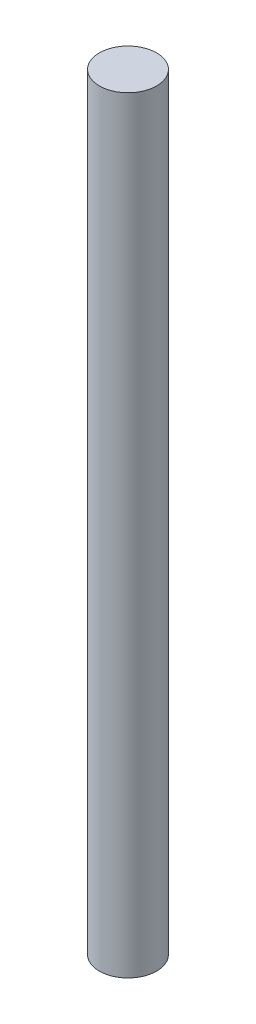
ISO-10303-21;
HEADER;
FILE_DESCRIPTION(('STEP AP214'),'2;1');
FILE_NAME('part.step','',(''),(''),'','','');
FILE_SCHEMA(('AUTOMOTIVE_DESIGN { 1 0 10303 214 1 1 1 1 }'));
ENDSEC;
DATA;
#1=APPLICATION_CONTEXT('core data for automotive mechanical design processes');
#2=APPLICATION_PROTOCOL_DEFINITION('international standard','automotive_design',2000,#1);
#3=PRODUCT_CONTEXT('',#1,'mechanical');
#4=PRODUCT('Part','Part','',(#3));
#5=PRODUCT_RELATED_PRODUCT_CATEGORY('part','',(#4));
#6=PRODUCT_DEFINITION_FORMATION('','',#4);
#7=PRODUCT_DEFINITION_CONTEXT('part definition',#1,'design');
#8=PRODUCT_DEFINITION('design','',#6,#7);
#9=PRODUCT_DEFINITION_SHAPE('','',#8);
#10=(LENGTH_UNIT() NAMED_UNIT(*) SI_UNIT(.MILLI.,.METRE.));
#11=(NAMED_UNIT(*) PLANE_ANGLE_UNIT() SI_UNIT($,.RADIAN.));
#12=(NAMED_UNIT(*) SI_UNIT($,.STERADIAN.) SOLID_ANGLE_UNIT());
#13=UNCERTAINTY_MEASURE_WITH_UNIT(LENGTH_MEASURE(1.E-05),#10,'distance_accuracy_value','');
#14=(GEOMETRIC_REPRESENTATION_CONTEXT(3) GLOBAL_UNCERTAINTY_ASSIGNED_CONTEXT((#13)) GLOBAL_UNIT_ASSIGNED_CONTEXT((#10,
#11,#12)) REPRESENTATION_CONTEXT('',''));
#15=CARTESIAN_POINT('',(0.,0.,0.));
#16=DIRECTION('',(0.,0.,1.));
#17=DIRECTION('',(1.,0.,0.));
#18=AXIS2_PLACEMENT_3D('',#15,#16,#17);
#19=CARTESIAN_POINT('',(0.,85.,0.));
#20=DIRECTION('',(0.,-1.,0.));
#21=DIRECTION('',(0.,0.,-1.));
#22=AXIS2_PLACEMENT_3D('',#19,#20,#21);
#23=CYLINDRICAL_SURFACE('',#22,6.34999999999999);
#24=CARTESIAN_POINT('',(0.,85.,0.));
#25=DIRECTION('',(0.,1.,0.));
#26=DIRECTION('',(0.,0.,1.));
#27=AXIS2_PLACEMENT_3D('',#24,#25,#26);
#28=CIRCLE('',#27,6.34999999999999);
#29=CARTESIAN_POINT('',(0.,85.,6.34999999999999));
#30=VERTEX_POINT('',#29);
#31=EDGE_CURVE('E10',#30,#30,#28,.T.);
#32=ORIENTED_EDGE('',*,*,#31,.F.);
#33=EDGE_LOOP('',(#32));
#34=FACE_BOUND('',#33,.T.);
#35=CARTESIAN_POINT('',(0.,-85.,0.));
#36=DIRECTION('',(0.,1.,0.));
#37=DIRECTION('',(0.,0.,1.));
#38=AXIS2_PLACEMENT_3D('',#35,#36,#37);
#39=CIRCLE('',#38,6.34999999999999);
#40=CARTESIAN_POINT('',(0.,-85.,6.34999999999999));
#41=VERTEX_POINT('',#40);
#42=EDGE_CURVE('E40',#41,#41,#39,.T.);
#43=ORIENTED_EDGE('',*,*,#42,.T.);
#44=EDGE_LOOP('',(#43));
#45=FACE_BOUND('',#44,.T.);
#46=ADVANCED_FACE('F37',(#34,#45),#23,.T.);
#47=CARTESIAN_POINT('',(0.,85.,0.));
#48=DIRECTION('',(0.,1.,0.));
#49=DIRECTION('',(0.,0.,1.));
#50=AXIS2_PLACEMENT_3D('',#47,#48,#49);
#51=PLANE('',#50);
#52=ORIENTED_EDGE('',*,*,#31,.T.);
#53=EDGE_LOOP('',(#52));
#54=FACE_BOUND('',#53,.T.);
#55=ADVANCED_FACE('F54',(#54),#51,.T.);
#56=CARTESIAN_POINT('',(0.,-85.,0.));
#57=DIRECTION('',(0.,1.,0.));
#58=DIRECTION('',(0.,0.,1.));
#59=AXIS2_PLACEMENT_3D('',#56,#57,#58);
#60=PLANE('',#59);
#61=ORIENTED_EDGE('',*,*,#42,.F.);
#62=EDGE_LOOP('',(#61));
#63=FACE_BOUND('',#62,.T.);
#64=ADVANCED_FACE('F52',(#63),#60,.F.);
#65=CLOSED_SHELL('',(#46,#55,#64));
#66=MANIFOLD_SOLID_BREP('B2',#65);
#67=ADVANCED_BREP_SHAPE_REPRESENTATION('',(#18,#66),#14);
#68=SHAPE_DEFINITION_REPRESENTATION(#9,#67);
ENDSEC;
END-ISO-10303-21;
